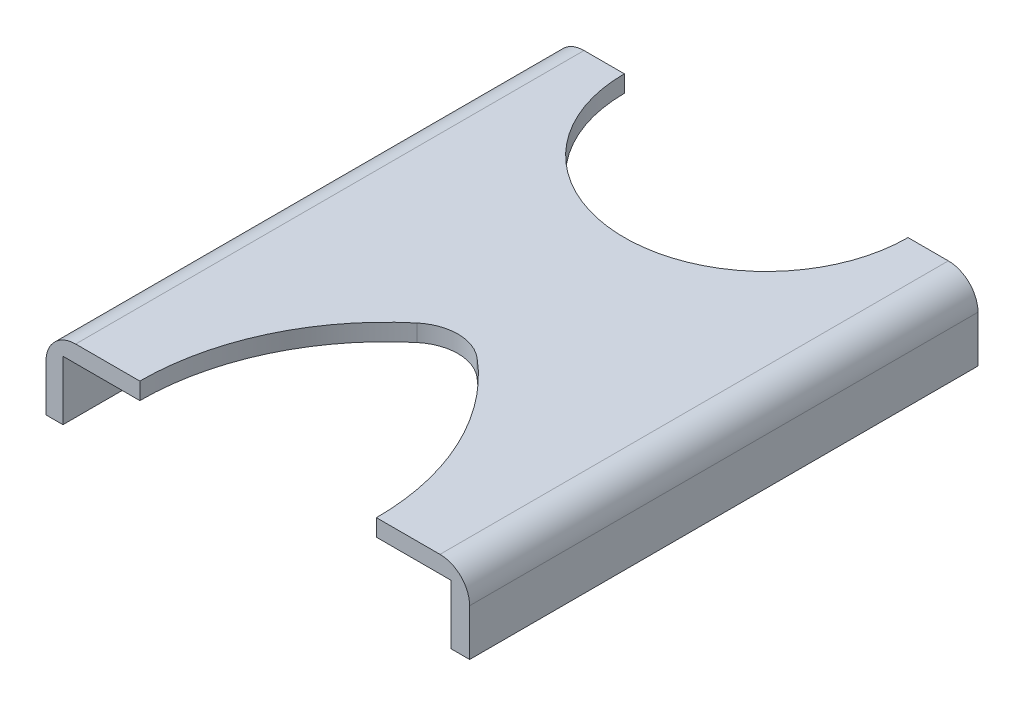
ISO-10303-21;
HEADER;
FILE_DESCRIPTION(('STEP AP214'),'2;1');
FILE_NAME('part.step','',(''),(''),'','','');
FILE_SCHEMA(('AUTOMOTIVE_DESIGN { 1 0 10303 214 1 1 1 1 }'));
ENDSEC;
DATA;
#1=APPLICATION_CONTEXT('core data for automotive mechanical design processes');
#2=APPLICATION_PROTOCOL_DEFINITION('international standard','automotive_design',2000,#1);
#3=PRODUCT_CONTEXT('',#1,'mechanical');
#4=PRODUCT('Part','Part','',(#3));
#5=PRODUCT_RELATED_PRODUCT_CATEGORY('part','',(#4));
#6=PRODUCT_DEFINITION_FORMATION('','',#4);
#7=PRODUCT_DEFINITION_CONTEXT('part definition',#1,'design');
#8=PRODUCT_DEFINITION('design','',#6,#7);
#9=PRODUCT_DEFINITION_SHAPE('','',#8);
#10=(LENGTH_UNIT() NAMED_UNIT(*) SI_UNIT(.MILLI.,.METRE.));
#11=(NAMED_UNIT(*) PLANE_ANGLE_UNIT() SI_UNIT($,.RADIAN.));
#12=(NAMED_UNIT(*) SI_UNIT($,.STERADIAN.) SOLID_ANGLE_UNIT());
#13=UNCERTAINTY_MEASURE_WITH_UNIT(LENGTH_MEASURE(1.E-05),#10,'distance_accuracy_value','');
#14=(GEOMETRIC_REPRESENTATION_CONTEXT(3) GLOBAL_UNCERTAINTY_ASSIGNED_CONTEXT((#13)) GLOBAL_UNIT_ASSIGNED_CONTEXT((#10,
#11,#12)) REPRESENTATION_CONTEXT('',''));
#15=CARTESIAN_POINT('',(0.,0.,0.));
#16=DIRECTION('',(0.,0.,1.));
#17=DIRECTION('',(1.,0.,0.));
#18=AXIS2_PLACEMENT_3D('',#15,#16,#17);
#19=CARTESIAN_POINT('',(0.,0.,0.));
#20=DIRECTION('',(0.,-1.,0.));
#21=DIRECTION('',(0.,0.,-1.));
#22=AXIS2_PLACEMENT_3D('',#19,#20,#21);
#23=PLANE('',#22);
#24=CARTESIAN_POINT('',(500.,0.,-1200.));
#25=DIRECTION('',(0.,-1.,0.));
#26=DIRECTION('',(0.,0.,-1.));
#27=AXIS2_PLACEMENT_3D('',#24,#25,#26);
#28=CIRCLE('',#27,334.802588384209);
#29=CARTESIAN_POINT('',(834.802588384209,0.,-1200.));
#30=VERTEX_POINT('',#29);
#31=CARTESIAN_POINT('',(165.197411615791,0.,-1200.));
#32=VERTEX_POINT('',#31);
#33=EDGE_CURVE('E340',#30,#32,#28,.T.);
#34=ORIENTED_EDGE('',*,*,#33,.F.);
#35=DIRECTION('',(-1.,0.,0.));
#36=VECTOR('',#35,1.);
#37=CARTESIAN_POINT('',(0.,0.,-1200.));
#38=LINE('',#37,#36);
#39=CARTESIAN_POINT('',(955.899733605082,0.,-1200.));
#40=VERTEX_POINT('',#39);
#41=EDGE_CURVE('E190',#40,#30,#38,.T.);
#42=ORIENTED_EDGE('',*,*,#41,.F.);
#43=DIRECTION('',(0.,0.,-1.));
#44=VECTOR('',#43,1.);
#45=CARTESIAN_POINT('',(955.899733605082,0.,0.));
#46=LINE('',#45,#44);
#47=CARTESIAN_POINT('',(955.899733605082,0.,0.));
#48=VERTEX_POINT('',#47);
#49=EDGE_CURVE('E285',#48,#40,#46,.T.);
#50=ORIENTED_EDGE('',*,*,#49,.F.);
#51=DIRECTION('',(1.,0.,0.));
#52=VECTOR('',#51,1.);
#53=CARTESIAN_POINT('',(0.,0.,0.));
#54=LINE('',#53,#52);
#55=CARTESIAN_POINT('',(780.,0.,0.));
#56=VERTEX_POINT('',#55);
#57=EDGE_CURVE('E200',#56,#48,#54,.T.);
#58=ORIENTED_EDGE('',*,*,#57,.F.);
#59=CARTESIAN_POINT('',(198.816645879522,0.,0.));
#60=DIRECTION('',(0.,-1.,0.));
#61=DIRECTION('',(0.,0.,-1.));
#62=AXIS2_PLACEMENT_3D('',#59,#60,#61);
#63=CIRCLE('',#62,581.183354120478);
#64=CARTESIAN_POINT('',(571.573934724937,0.,-445.899197935301));
#65=VERTEX_POINT('',#64);
#66=EDGE_CURVE('E164',#65,#56,#63,.T.);
#67=ORIENTED_EDGE('',*,*,#66,.F.);
#68=CARTESIAN_POINT('',(500.720540100466,0.,-361.143050223466));
#69=DIRECTION('',(0.,-1.,0.));
#70=DIRECTION('',(0.,0.,-1.));
#71=AXIS2_PLACEMENT_3D('',#68,#69,#70);
#72=CIRCLE('',#71,110.470847307158);
#73=CARTESIAN_POINT('',(429.867145475994,0.,-445.899197935301));
#74=VERTEX_POINT('',#73);
#75=EDGE_CURVE('E348',#65,#74,#72,.F.);
#76=ORIENTED_EDGE('',*,*,#75,.T.);
#77=CARTESIAN_POINT('',(802.624434321409,0.,0.));
#78=DIRECTION('',(0.,-1.,0.));
#79=DIRECTION('',(0.,0.,-1.));
#80=AXIS2_PLACEMENT_3D('',#77,#78,#79);
#81=CIRCLE('',#80,581.183354120478);
#82=CARTESIAN_POINT('',(221.441080200931,0.,0.));
#83=VERTEX_POINT('',#82);
#84=EDGE_CURVE('E343',#74,#83,#81,.F.);
#85=ORIENTED_EDGE('',*,*,#84,.T.);
#86=CARTESIAN_POINT('',(40.,0.,0.));
#87=VERTEX_POINT('',#86);
#88=EDGE_CURVE('E173',#87,#83,#54,.T.);
#89=ORIENTED_EDGE('',*,*,#88,.F.);
#90=DIRECTION('',(0.,0.,1.));
#91=VECTOR('',#90,1.);
#92=CARTESIAN_POINT('',(40.,0.,0.));
#93=LINE('',#92,#91);
#94=CARTESIAN_POINT('',(40.0000000000001,0.,-1200.));
#95=VERTEX_POINT('',#94);
#96=EDGE_CURVE('E266',#95,#87,#93,.T.);
#97=ORIENTED_EDGE('',*,*,#96,.F.);
#98=EDGE_CURVE('E199',#32,#95,#38,.T.);
#99=ORIENTED_EDGE('',*,*,#98,.F.);
#100=EDGE_LOOP('',(#34,#42,#50,#58,#67,#76,#85,#89,#97,#99));
#101=FACE_BOUND('',#100,.T.);
#102=ADVANCED_FACE('F39',(#101),#23,.T.);
#103=CARTESIAN_POINT('',(0.,40.,0.));
#104=DIRECTION('',(0.,0.,-1.));
#105=DIRECTION('',(-1.,0.,0.));
#106=AXIS2_PLACEMENT_3D('',#103,#104,#105);
#107=PLANE('',#106);
#108=DIRECTION('',(0.,1.,0.));
#109=VECTOR('',#108,1.);
#110=CARTESIAN_POINT('',(221.441080200931,-100.,0.));
#111=LINE('',#110,#109);
#112=CARTESIAN_POINT('',(221.441080200931,40.,0.));
#113=VERTEX_POINT('',#112);
#114=EDGE_CURVE('E155',#83,#113,#111,.T.);
#115=ORIENTED_EDGE('',*,*,#114,.T.);
#116=DIRECTION('',(1.,0.,0.));
#117=VECTOR('',#116,1.);
#118=CARTESIAN_POINT('',(0.,40.,0.));
#119=LINE('',#118,#117);
#120=CARTESIAN_POINT('',(70.,40.,0.));
#121=VERTEX_POINT('',#120);
#122=EDGE_CURVE('E171',#121,#113,#119,.T.);
#123=ORIENTED_EDGE('',*,*,#122,.F.);
#124=CARTESIAN_POINT('',(70.,-30.,0.));
#125=DIRECTION('',(0.,0.,-1.));
#126=DIRECTION('',(-1.,0.,0.));
#127=AXIS2_PLACEMENT_3D('',#124,#125,#126);
#128=CIRCLE('',#127,70.);
#129=CARTESIAN_POINT('',(0.,-30.,0.));
#130=VERTEX_POINT('',#129);
#131=EDGE_CURVE('E231',#121,#130,#128,.F.);
#132=ORIENTED_EDGE('',*,*,#131,.T.);
#133=DIRECTION('',(0.,-1.,0.));
#134=VECTOR('',#133,1.);
#135=CARTESIAN_POINT('',(0.,40.,0.));
#136=LINE('',#135,#134);
#137=CARTESIAN_POINT('',(0.,-140.,0.));
#138=VERTEX_POINT('',#137);
#139=EDGE_CURVE('E212',#130,#138,#136,.T.);
#140=ORIENTED_EDGE('',*,*,#139,.T.);
#141=DIRECTION('',(-1.,0.,0.));
#142=VECTOR('',#141,1.);
#143=CARTESIAN_POINT('',(0.,-140.,0.));
#144=LINE('',#143,#142);
#145=CARTESIAN_POINT('',(40.,-140.,0.));
#146=VERTEX_POINT('',#145);
#147=EDGE_CURVE('E255',#146,#138,#144,.T.);
#148=ORIENTED_EDGE('',*,*,#147,.F.);
#149=DIRECTION('',(0.,1.,0.));
#150=VECTOR('',#149,1.);
#151=CARTESIAN_POINT('',(40.,-140.,0.));
#152=LINE('',#151,#150);
#153=EDGE_CURVE('E263',#146,#87,#152,.T.);
#154=ORIENTED_EDGE('',*,*,#153,.T.);
#155=ORIENTED_EDGE('',*,*,#88,.T.);
#156=EDGE_LOOP('',(#115,#123,#132,#140,#148,#154,#155));
#157=FACE_BOUND('',#156,.T.);
#158=ADVANCED_FACE('F170',(#157),#107,.F.);
#159=CARTESIAN_POINT('',(0.,40.,-1200.));
#160=DIRECTION('',(0.,0.,1.));
#161=DIRECTION('',(1.,0.,0.));
#162=AXIS2_PLACEMENT_3D('',#159,#160,#161);
#163=PLANE('',#162);
#164=ORIENTED_EDGE('',*,*,#41,.T.);
#165=DIRECTION('',(0.,1.,0.));
#166=VECTOR('',#165,1.);
#167=CARTESIAN_POINT('',(834.802588384209,-100.,-1200.));
#168=LINE('',#167,#166);
#169=CARTESIAN_POINT('',(834.802588384209,40.,-1200.));
#170=VERTEX_POINT('',#169);
#171=EDGE_CURVE('E272',#30,#170,#168,.T.);
#172=ORIENTED_EDGE('',*,*,#171,.T.);
#173=DIRECTION('',(-1.,0.,0.));
#174=VECTOR('',#173,1.);
#175=CARTESIAN_POINT('',(0.,40.,-1200.));
#176=LINE('',#175,#174);
#177=CARTESIAN_POINT('',(930.,40.,-1200.));
#178=VERTEX_POINT('',#177);
#179=EDGE_CURVE('E188',#178,#170,#176,.T.);
#180=ORIENTED_EDGE('',*,*,#179,.F.);
#181=CARTESIAN_POINT('',(930.,-30.,-1200.));
#182=DIRECTION('',(0.,0.,1.));
#183=DIRECTION('',(1.,0.,0.));
#184=AXIS2_PLACEMENT_3D('',#181,#182,#183);
#185=CIRCLE('',#184,70.);
#186=CARTESIAN_POINT('',(1000.,-30.,-1200.));
#187=VERTEX_POINT('',#186);
#188=EDGE_CURVE('E225',#178,#187,#185,.F.);
#189=ORIENTED_EDGE('',*,*,#188,.T.);
#190=DIRECTION('',(0.,-1.,0.));
#191=VECTOR('',#190,1.);
#192=CARTESIAN_POINT('',(1000.,40.,-1200.));
#193=LINE('',#192,#191);
#194=CARTESIAN_POINT('',(1000.,-140.,-1200.));
#195=VERTEX_POINT('',#194);
#196=EDGE_CURVE('E206',#187,#195,#193,.T.);
#197=ORIENTED_EDGE('',*,*,#196,.T.);
#198=DIRECTION('',(1.,0.,0.));
#199=VECTOR('',#198,1.);
#200=CARTESIAN_POINT('',(1000.,-140.,-1200.));
#201=LINE('',#200,#199);
#202=CARTESIAN_POINT('',(955.899733605082,-140.,-1200.));
#203=VERTEX_POINT('',#202);
#204=EDGE_CURVE('E296',#203,#195,#201,.T.);
#205=ORIENTED_EDGE('',*,*,#204,.F.);
#206=DIRECTION('',(0.,1.,0.));
#207=VECTOR('',#206,1.);
#208=CARTESIAN_POINT('',(955.899733605082,-140.,-1200.));
#209=LINE('',#208,#207);
#210=EDGE_CURVE('E300',#203,#40,#209,.T.);
#211=ORIENTED_EDGE('',*,*,#210,.T.);
#212=EDGE_LOOP('',(#164,#172,#180,#189,#197,#205,#211));
#213=FACE_BOUND('',#212,.T.);
#214=ADVANCED_FACE('F324',(#213),#163,.F.);
#215=CARTESIAN_POINT('',(0.,40.,0.));
#216=DIRECTION('',(0.,-1.,0.));
#217=DIRECTION('',(0.,0.,-1.));
#218=AXIS2_PLACEMENT_3D('',#215,#216,#217);
#219=PLANE('',#218);
#220=ORIENTED_EDGE('',*,*,#179,.T.);
#221=CARTESIAN_POINT('',(500.,40.,-1200.));
#222=DIRECTION('',(0.,-1.,0.));
#223=DIRECTION('',(0.,0.,-1.));
#224=AXIS2_PLACEMENT_3D('',#221,#222,#223);
#225=CIRCLE('',#224,334.802588384209);
#226=CARTESIAN_POINT('',(165.197411615791,40.,-1200.));
#227=VERTEX_POINT('',#226);
#228=EDGE_CURVE('E11',#170,#227,#225,.T.);
#229=ORIENTED_EDGE('',*,*,#228,.T.);
#230=CARTESIAN_POINT('',(70.,40.,-1200.));
#231=VERTEX_POINT('',#230);
#232=EDGE_CURVE('E183',#227,#231,#176,.T.);
#233=ORIENTED_EDGE('',*,*,#232,.T.);
#234=DIRECTION('',(0.,0.,1.));
#235=VECTOR('',#234,1.);
#236=CARTESIAN_POINT('',(70.,40.,0.));
#237=LINE('',#236,#235);
#238=EDGE_CURVE('E181',#231,#121,#237,.T.);
#239=ORIENTED_EDGE('',*,*,#238,.T.);
#240=ORIENTED_EDGE('',*,*,#122,.T.);
#241=CARTESIAN_POINT('',(802.624434321409,40.,0.));
#242=DIRECTION('',(0.,-1.,0.));
#243=DIRECTION('',(0.,0.,-1.));
#244=AXIS2_PLACEMENT_3D('',#241,#242,#243);
#245=CIRCLE('',#244,581.183354120478);
#246=CARTESIAN_POINT('',(429.867145475994,40.,-445.899197935301));
#247=VERTEX_POINT('',#246);
#248=EDGE_CURVE('E152',#113,#247,#245,.T.);
#249=ORIENTED_EDGE('',*,*,#248,.T.);
#250=CARTESIAN_POINT('',(500.720540100466,40.,-361.143050223466));
#251=DIRECTION('',(0.,-1.,0.));
#252=DIRECTION('',(0.,0.,-1.));
#253=AXIS2_PLACEMENT_3D('',#250,#251,#252);
#254=CIRCLE('',#253,110.470847307158);
#255=CARTESIAN_POINT('',(571.573934724937,40.,-445.899197935301));
#256=VERTEX_POINT('',#255);
#257=EDGE_CURVE('E165',#247,#256,#254,.T.);
#258=ORIENTED_EDGE('',*,*,#257,.T.);
#259=CARTESIAN_POINT('',(198.816645879522,40.,0.));
#260=DIRECTION('',(0.,1.,0.));
#261=DIRECTION('',(0.,0.,1.));
#262=AXIS2_PLACEMENT_3D('',#259,#260,#261);
#263=CIRCLE('',#262,581.183354120478);
#264=CARTESIAN_POINT('',(780.,40.,0.));
#265=VERTEX_POINT('',#264);
#266=EDGE_CURVE('E175',#265,#256,#263,.T.);
#267=ORIENTED_EDGE('',*,*,#266,.F.);
#268=CARTESIAN_POINT('',(930.,40.,0.));
#269=VERTEX_POINT('',#268);
#270=EDGE_CURVE('E184',#265,#269,#119,.T.);
#271=ORIENTED_EDGE('',*,*,#270,.T.);
#272=DIRECTION('',(0.,0.,-1.));
#273=VECTOR('',#272,1.);
#274=CARTESIAN_POINT('',(930.,40.,0.));
#275=LINE('',#274,#273);
#276=EDGE_CURVE('E217',#269,#178,#275,.T.);
#277=ORIENTED_EDGE('',*,*,#276,.T.);
#278=EDGE_LOOP('',(#220,#229,#233,#239,#240,#249,#258,#267,#271,#277));
#279=FACE_BOUND('',#278,.T.);
#280=ADVANCED_FACE('F179',(#279),#219,.F.);
#281=CARTESIAN_POINT('',(0.,40.,0.));
#282=DIRECTION('',(1.,0.,0.));
#283=DIRECTION('',(0.,0.,-1.));
#284=AXIS2_PLACEMENT_3D('',#281,#282,#283);
#285=PLANE('',#284);
#286=ORIENTED_EDGE('',*,*,#139,.F.);
#287=DIRECTION('',(0.,0.,1.));
#288=VECTOR('',#287,1.);
#289=CARTESIAN_POINT('',(0.,-30.,0.));
#290=LINE('',#289,#288);
#291=CARTESIAN_POINT('',(0.,-30.,-1200.));
#292=VERTEX_POINT('',#291);
#293=EDGE_CURVE('E48',#130,#292,#290,.F.);
#294=ORIENTED_EDGE('',*,*,#293,.T.);
#295=DIRECTION('',(0.,-1.,0.));
#296=VECTOR('',#295,1.);
#297=CARTESIAN_POINT('',(0.,40.,-1200.));
#298=LINE('',#297,#296);
#299=CARTESIAN_POINT('',(0.,-140.,-1200.));
#300=VERTEX_POINT('',#299);
#301=EDGE_CURVE('E196',#292,#300,#298,.T.);
#302=ORIENTED_EDGE('',*,*,#301,.T.);
#303=DIRECTION('',(0.,0.,-1.));
#304=VECTOR('',#303,1.);
#305=CARTESIAN_POINT('',(0.,-140.,0.));
#306=LINE('',#305,#304);
#307=EDGE_CURVE('E258',#138,#300,#306,.T.);
#308=ORIENTED_EDGE('',*,*,#307,.F.);
#309=EDGE_LOOP('',(#286,#294,#302,#308));
#310=FACE_BOUND('',#309,.T.);
#311=ADVANCED_FACE('F242',(#310),#285,.F.);
#312=ORIENTED_EDGE('',*,*,#270,.F.);
#313=DIRECTION('',(0.,1.,0.));
#314=VECTOR('',#313,1.);
#315=CARTESIAN_POINT('',(780.,-100.,0.));
#316=LINE('',#315,#314);
#317=EDGE_CURVE('E62',#56,#265,#316,.T.);
#318=ORIENTED_EDGE('',*,*,#317,.F.);
#319=ORIENTED_EDGE('',*,*,#57,.T.);
#320=DIRECTION('',(0.,1.,0.));
#321=VECTOR('',#320,1.);
#322=CARTESIAN_POINT('',(955.899733605082,-140.,0.));
#323=LINE('',#322,#321);
#324=CARTESIAN_POINT('',(955.899733605082,-140.,0.));
#325=VERTEX_POINT('',#324);
#326=EDGE_CURVE('E192',#325,#48,#323,.T.);
#327=ORIENTED_EDGE('',*,*,#326,.F.);
#328=DIRECTION('',(-1.,0.,0.));
#329=VECTOR('',#328,1.);
#330=CARTESIAN_POINT('',(1000.,-140.,0.));
#331=LINE('',#330,#329);
#332=CARTESIAN_POINT('',(1000.,-140.,0.));
#333=VERTEX_POINT('',#332);
#334=EDGE_CURVE('E290',#333,#325,#331,.T.);
#335=ORIENTED_EDGE('',*,*,#334,.F.);
#336=DIRECTION('',(0.,-1.,0.));
#337=VECTOR('',#336,1.);
#338=CARTESIAN_POINT('',(1000.,40.,0.));
#339=LINE('',#338,#337);
#340=CARTESIAN_POINT('',(1000.,-30.,0.));
#341=VERTEX_POINT('',#340);
#342=EDGE_CURVE('E209',#341,#333,#339,.T.);
#343=ORIENTED_EDGE('',*,*,#342,.F.);
#344=CARTESIAN_POINT('',(930.,-30.,0.));
#345=DIRECTION('',(0.,0.,-1.));
#346=DIRECTION('',(-1.,0.,0.));
#347=AXIS2_PLACEMENT_3D('',#344,#345,#346);
#348=CIRCLE('',#347,70.);
#349=EDGE_CURVE('E234',#341,#269,#348,.F.);
#350=ORIENTED_EDGE('',*,*,#349,.T.);
#351=EDGE_LOOP('',(#312,#318,#319,#327,#335,#343,#350));
#352=FACE_BOUND('',#351,.T.);
#353=ADVANCED_FACE('F318',(#352),#107,.F.);
#354=CARTESIAN_POINT('',(1000.,40.,0.));
#355=DIRECTION('',(-1.,0.,0.));
#356=DIRECTION('',(0.,0.,1.));
#357=AXIS2_PLACEMENT_3D('',#354,#355,#356);
#358=PLANE('',#357);
#359=ORIENTED_EDGE('',*,*,#196,.F.);
#360=DIRECTION('',(0.,0.,-1.));
#361=VECTOR('',#360,1.);
#362=CARTESIAN_POINT('',(1000.,-30.,0.));
#363=LINE('',#362,#361);
#364=EDGE_CURVE('E228',#187,#341,#363,.F.);
#365=ORIENTED_EDGE('',*,*,#364,.T.);
#366=ORIENTED_EDGE('',*,*,#342,.T.);
#367=DIRECTION('',(0.,0.,1.));
#368=VECTOR('',#367,1.);
#369=CARTESIAN_POINT('',(1000.,-140.,0.));
#370=LINE('',#369,#368);
#371=EDGE_CURVE('E286',#195,#333,#370,.T.);
#372=ORIENTED_EDGE('',*,*,#371,.F.);
#373=EDGE_LOOP('',(#359,#365,#366,#372));
#374=FACE_BOUND('',#373,.T.);
#375=ADVANCED_FACE('F330',(#374),#358,.F.);
#376=ORIENTED_EDGE('',*,*,#232,.F.);
#377=DIRECTION('',(0.,1.,0.));
#378=VECTOR('',#377,1.);
#379=CARTESIAN_POINT('',(165.197411615791,-100.,-1200.));
#380=LINE('',#379,#378);
#381=EDGE_CURVE('E55',#227,#32,#380,.F.);
#382=ORIENTED_EDGE('',*,*,#381,.T.);
#383=ORIENTED_EDGE('',*,*,#98,.T.);
#384=DIRECTION('',(0.,1.,0.));
#385=VECTOR('',#384,1.);
#386=CARTESIAN_POINT('',(40.0000000000001,-140.,-1200.));
#387=LINE('',#386,#385);
#388=CARTESIAN_POINT('',(40.0000000000001,-140.,-1200.));
#389=VERTEX_POINT('',#388);
#390=EDGE_CURVE('E281',#389,#95,#387,.T.);
#391=ORIENTED_EDGE('',*,*,#390,.F.);
#392=DIRECTION('',(1.,0.,0.));
#393=VECTOR('',#392,1.);
#394=CARTESIAN_POINT('',(0.,-140.,-1200.));
#395=LINE('',#394,#393);
#396=EDGE_CURVE('E251',#300,#389,#395,.T.);
#397=ORIENTED_EDGE('',*,*,#396,.F.);
#398=ORIENTED_EDGE('',*,*,#301,.F.);
#399=CARTESIAN_POINT('',(70.,-30.,-1200.));
#400=DIRECTION('',(0.,0.,1.));
#401=DIRECTION('',(1.,0.,0.));
#402=AXIS2_PLACEMENT_3D('',#399,#400,#401);
#403=CIRCLE('',#402,70.);
#404=EDGE_CURVE('E221',#292,#231,#403,.F.);
#405=ORIENTED_EDGE('',*,*,#404,.T.);
#406=EDGE_LOOP('',(#376,#382,#383,#391,#397,#398,#405));
#407=FACE_BOUND('',#406,.T.);
#408=ADVANCED_FACE('F249',(#407),#163,.F.);
#409=CARTESIAN_POINT('',(955.899733605082,-140.,0.));
#410=DIRECTION('',(1.,0.,0.));
#411=DIRECTION('',(0.,0.,-1.));
#412=AXIS2_PLACEMENT_3D('',#409,#410,#411);
#413=PLANE('',#412);
#414=ORIENTED_EDGE('',*,*,#49,.T.);
#415=ORIENTED_EDGE('',*,*,#210,.F.);
#416=DIRECTION('',(0.,0.,-1.));
#417=VECTOR('',#416,1.);
#418=CARTESIAN_POINT('',(955.899733605082,-140.,0.));
#419=LINE('',#418,#417);
#420=EDGE_CURVE('E293',#325,#203,#419,.T.);
#421=ORIENTED_EDGE('',*,*,#420,.F.);
#422=ORIENTED_EDGE('',*,*,#326,.T.);
#423=EDGE_LOOP('',(#414,#415,#421,#422));
#424=FACE_BOUND('',#423,.T.);
#425=ADVANCED_FACE('F323',(#424),#413,.F.);
#426=CARTESIAN_POINT('',(0.,-140.,0.));
#427=DIRECTION('',(0.,1.,0.));
#428=DIRECTION('',(0.,0.,1.));
#429=AXIS2_PLACEMENT_3D('',#426,#427,#428);
#430=PLANE('',#429);
#431=ORIENTED_EDGE('',*,*,#371,.T.);
#432=ORIENTED_EDGE('',*,*,#334,.T.);
#433=ORIENTED_EDGE('',*,*,#420,.T.);
#434=ORIENTED_EDGE('',*,*,#204,.T.);
#435=EDGE_LOOP('',(#431,#432,#433,#434));
#436=FACE_BOUND('',#435,.T.);
#437=ADVANCED_FACE('F328',(#436),#430,.F.);
#438=CARTESIAN_POINT('',(40.,-140.,0.));
#439=DIRECTION('',(-1.,0.,0.));
#440=DIRECTION('',(0.,0.,1.));
#441=AXIS2_PLACEMENT_3D('',#438,#439,#440);
#442=PLANE('',#441);
#443=ORIENTED_EDGE('',*,*,#96,.T.);
#444=ORIENTED_EDGE('',*,*,#153,.F.);
#445=DIRECTION('',(0.,0.,1.));
#446=VECTOR('',#445,1.);
#447=CARTESIAN_POINT('',(40.,-140.,0.));
#448=LINE('',#447,#446);
#449=EDGE_CURVE('E260',#389,#146,#448,.T.);
#450=ORIENTED_EDGE('',*,*,#449,.F.);
#451=ORIENTED_EDGE('',*,*,#390,.T.);
#452=EDGE_LOOP('',(#443,#444,#450,#451));
#453=FACE_BOUND('',#452,.T.);
#454=ADVANCED_FACE('F398',(#453),#442,.F.);
#455=CARTESIAN_POINT('',(0.,-140.,0.));
#456=DIRECTION('',(0.,-1.,0.));
#457=DIRECTION('',(0.,0.,-1.));
#458=AXIS2_PLACEMENT_3D('',#455,#456,#457);
#459=PLANE('',#458);
#460=ORIENTED_EDGE('',*,*,#307,.T.);
#461=ORIENTED_EDGE('',*,*,#396,.T.);
#462=ORIENTED_EDGE('',*,*,#449,.T.);
#463=ORIENTED_EDGE('',*,*,#147,.T.);
#464=EDGE_LOOP('',(#460,#461,#462,#463));
#465=FACE_BOUND('',#464,.T.);
#466=ADVANCED_FACE('F257',(#465),#459,.T.);
#467=CARTESIAN_POINT('',(930.,-30.,0.));
#468=DIRECTION('',(0.,0.,-1.));
#469=DIRECTION('',(-1.,0.,0.));
#470=AXIS2_PLACEMENT_3D('',#467,#468,#469);
#471=CYLINDRICAL_SURFACE('',#470,70.);
#472=ORIENTED_EDGE('',*,*,#349,.F.);
#473=ORIENTED_EDGE('',*,*,#364,.F.);
#474=ORIENTED_EDGE('',*,*,#188,.F.);
#475=ORIENTED_EDGE('',*,*,#276,.F.);
#476=EDGE_LOOP('',(#472,#473,#474,#475));
#477=FACE_BOUND('',#476,.T.);
#478=ADVANCED_FACE('F336',(#477),#471,.T.);
#479=CARTESIAN_POINT('',(70.,-30.,0.));
#480=DIRECTION('',(0.,0.,1.));
#481=DIRECTION('',(1.,0.,0.));
#482=AXIS2_PLACEMENT_3D('',#479,#480,#481);
#483=CYLINDRICAL_SURFACE('',#482,70.);
#484=ORIENTED_EDGE('',*,*,#404,.F.);
#485=ORIENTED_EDGE('',*,*,#293,.F.);
#486=ORIENTED_EDGE('',*,*,#131,.F.);
#487=ORIENTED_EDGE('',*,*,#238,.F.);
#488=EDGE_LOOP('',(#484,#485,#486,#487));
#489=FACE_BOUND('',#488,.T.);
#490=ADVANCED_FACE('F41',(#489),#483,.T.);
#491=CARTESIAN_POINT('',(802.624434321409,-100.,0.));
#492=DIRECTION('',(0.,1.,0.));
#493=DIRECTION('',(0.,0.,1.));
#494=AXIS2_PLACEMENT_3D('',#491,#492,#493);
#495=CYLINDRICAL_SURFACE('',#494,581.183354120478);
#496=DIRECTION('',(0.,1.,0.));
#497=VECTOR('',#496,1.);
#498=CARTESIAN_POINT('',(429.867145475994,-100.,-445.899197935301));
#499=LINE('',#498,#497);
#500=EDGE_CURVE('E158',#74,#247,#499,.T.);
#501=ORIENTED_EDGE('',*,*,#500,.T.);
#502=ORIENTED_EDGE('',*,*,#248,.F.);
#503=ORIENTED_EDGE('',*,*,#114,.F.);
#504=ORIENTED_EDGE('',*,*,#84,.F.);
#505=EDGE_LOOP('',(#501,#502,#503,#504));
#506=FACE_BOUND('',#505,.T.);
#507=ADVANCED_FACE('F154',(#506),#495,.F.);
#508=CARTESIAN_POINT('',(500.720540100466,-100.,-361.143050223466));
#509=DIRECTION('',(0.,1.,0.));
#510=DIRECTION('',(0.,0.,1.));
#511=AXIS2_PLACEMENT_3D('',#508,#509,#510);
#512=CYLINDRICAL_SURFACE('',#511,110.470847307158);
#513=DIRECTION('',(0.,1.,0.));
#514=VECTOR('',#513,1.);
#515=CARTESIAN_POINT('',(571.573934724937,-100.,-445.899197935301));
#516=LINE('',#515,#514);
#517=EDGE_CURVE('E360',#65,#256,#516,.T.);
#518=ORIENTED_EDGE('',*,*,#517,.T.);
#519=ORIENTED_EDGE('',*,*,#257,.F.);
#520=ORIENTED_EDGE('',*,*,#500,.F.);
#521=ORIENTED_EDGE('',*,*,#75,.F.);
#522=EDGE_LOOP('',(#518,#519,#520,#521));
#523=FACE_BOUND('',#522,.T.);
#524=ADVANCED_FACE('F366',(#523),#512,.F.);
#525=CARTESIAN_POINT('',(198.816645879522,-100.,0.));
#526=DIRECTION('',(0.,1.,0.));
#527=DIRECTION('',(0.,0.,1.));
#528=AXIS2_PLACEMENT_3D('',#525,#526,#527);
#529=CYLINDRICAL_SURFACE('',#528,581.183354120478);
#530=ORIENTED_EDGE('',*,*,#66,.T.);
#531=ORIENTED_EDGE('',*,*,#317,.T.);
#532=ORIENTED_EDGE('',*,*,#266,.T.);
#533=ORIENTED_EDGE('',*,*,#517,.F.);
#534=EDGE_LOOP('',(#530,#531,#532,#533));
#535=FACE_BOUND('',#534,.T.);
#536=ADVANCED_FACE('F367',(#535),#529,.F.);
#537=CARTESIAN_POINT('',(500.,-100.,-1200.));
#538=DIRECTION('',(0.,1.,0.));
#539=DIRECTION('',(0.,0.,1.));
#540=AXIS2_PLACEMENT_3D('',#537,#538,#539);
#541=CYLINDRICAL_SURFACE('',#540,334.802588384209);
#542=ORIENTED_EDGE('',*,*,#33,.T.);
#543=ORIENTED_EDGE('',*,*,#381,.F.);
#544=ORIENTED_EDGE('',*,*,#228,.F.);
#545=ORIENTED_EDGE('',*,*,#171,.F.);
#546=EDGE_LOOP('',(#542,#543,#544,#545));
#547=FACE_BOUND('',#546,.T.);
#548=ADVANCED_FACE('F369',(#547),#541,.F.);
#549=CLOSED_SHELL('',(#102,#158,#214,#280,#311,#353,#375,#408,#425,#437,#454,#466,#478,#490,
#507,#524,#536,#548));
#550=MANIFOLD_SOLID_BREP('B2',#549);
#551=ADVANCED_BREP_SHAPE_REPRESENTATION('',(#18,#550),#14);
#552=SHAPE_DEFINITION_REPRESENTATION(#9,#551);
ENDSEC;
END-ISO-10303-21;
